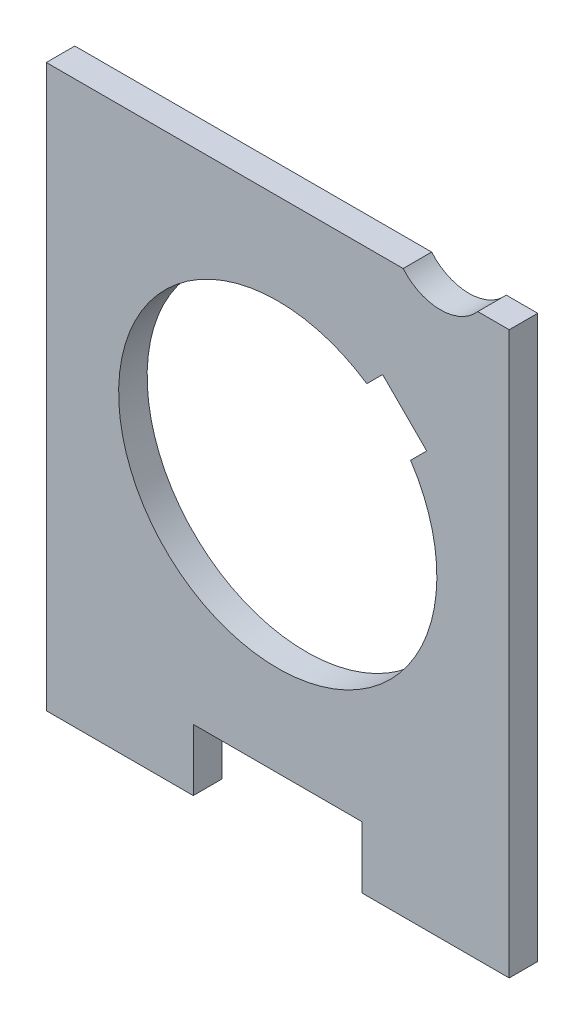
ISO-10303-21;
HEADER;
FILE_DESCRIPTION(('STEP AP214'),'2;1');
FILE_NAME('part.step','',(''),(''),'','','');
FILE_SCHEMA(('AUTOMOTIVE_DESIGN { 1 0 10303 214 1 1 1 1 }'));
ENDSEC;
DATA;
#1=APPLICATION_CONTEXT('core data for automotive mechanical design processes');
#2=APPLICATION_PROTOCOL_DEFINITION('international standard','automotive_design',2000,#1);
#3=PRODUCT_CONTEXT('',#1,'mechanical');
#4=PRODUCT('Part','Part','',(#3));
#5=PRODUCT_RELATED_PRODUCT_CATEGORY('part','',(#4));
#6=PRODUCT_DEFINITION_FORMATION('','',#4);
#7=PRODUCT_DEFINITION_CONTEXT('part definition',#1,'design');
#8=PRODUCT_DEFINITION('design','',#6,#7);
#9=PRODUCT_DEFINITION_SHAPE('','',#8);
#10=(LENGTH_UNIT() NAMED_UNIT(*) SI_UNIT(.MILLI.,.METRE.));
#11=(NAMED_UNIT(*) PLANE_ANGLE_UNIT() SI_UNIT($,.RADIAN.));
#12=(NAMED_UNIT(*) SI_UNIT($,.STERADIAN.) SOLID_ANGLE_UNIT());
#13=UNCERTAINTY_MEASURE_WITH_UNIT(LENGTH_MEASURE(1.E-05),#10,'distance_accuracy_value','');
#14=(GEOMETRIC_REPRESENTATION_CONTEXT(3) GLOBAL_UNCERTAINTY_ASSIGNED_CONTEXT((#13)) GLOBAL_UNIT_ASSIGNED_CONTEXT((#10,
#11,#12)) REPRESENTATION_CONTEXT('',''));
#15=CARTESIAN_POINT('',(0.,0.,0.));
#16=DIRECTION('',(0.,0.,1.));
#17=DIRECTION('',(1.,0.,0.));
#18=AXIS2_PLACEMENT_3D('',#15,#16,#17);
#19=CARTESIAN_POINT('',(0.,43.18,2.4638));
#20=DIRECTION('',(0.,-1.,0.));
#21=DIRECTION('',(0.,0.,-1.));
#22=AXIS2_PLACEMENT_3D('',#19,#20,#21);
#23=PLANE('',#22);
#24=DIRECTION('',(-1.,0.,0.));
#25=VECTOR('',#24,1.);
#26=CARTESIAN_POINT('',(0.,43.18,0.));
#27=LINE('',#26,#25);
#28=CARTESIAN_POINT('',(40.,43.18,0.));
#29=VERTEX_POINT('',#28);
#30=CARTESIAN_POINT('',(37.2830228705034,43.18,0.));
#31=VERTEX_POINT('',#30);
#32=EDGE_CURVE('E151',#29,#31,#27,.T.);
#33=ORIENTED_EDGE('',*,*,#32,.T.);
#34=DIRECTION('',(0.,0.,1.));
#35=VECTOR('',#34,1.);
#36=CARTESIAN_POINT('',(37.2830228705034,43.18,-5.00000000014378E-05));
#37=LINE('',#36,#35);
#38=CARTESIAN_POINT('',(37.2830228705034,43.18,2.4638));
#39=VERTEX_POINT('',#38);
#40=EDGE_CURVE('E46',#31,#39,#37,.T.);
#41=ORIENTED_EDGE('',*,*,#40,.T.);
#42=DIRECTION('',(-1.,0.,0.));
#43=VECTOR('',#42,1.);
#44=CARTESIAN_POINT('',(0.,43.18,2.4638));
#45=LINE('',#44,#43);
#46=CARTESIAN_POINT('',(40.,43.18,2.4638));
#47=VERTEX_POINT('',#46);
#48=EDGE_CURVE('E162',#47,#39,#45,.T.);
#49=ORIENTED_EDGE('',*,*,#48,.F.);
#50=DIRECTION('',(0.,0.,-1.));
#51=VECTOR('',#50,1.);
#52=CARTESIAN_POINT('',(40.,43.18,2.4638));
#53=LINE('',#52,#51);
#54=EDGE_CURVE('E161',#47,#29,#53,.T.);
#55=ORIENTED_EDGE('',*,*,#54,.T.);
#56=EDGE_LOOP('',(#33,#41,#49,#55));
#57=FACE_BOUND('',#56,.T.);
#58=ADVANCED_FACE('F32',(#57),#23,.F.);
#59=CARTESIAN_POINT('',(0.,0.,2.4638));
#60=DIRECTION('',(0.,1.,0.));
#61=DIRECTION('',(0.,0.,1.));
#62=AXIS2_PLACEMENT_3D('',#59,#60,#61);
#63=PLANE('',#62);
#64=DIRECTION('',(0.,0.,-1.));
#65=VECTOR('',#64,1.);
#66=CARTESIAN_POINT('',(27.3,0.,0.));
#67=LINE('',#66,#65);
#68=CARTESIAN_POINT('',(27.3,0.,2.4638));
#69=VERTEX_POINT('',#68);
#70=CARTESIAN_POINT('',(27.3,0.,0.));
#71=VERTEX_POINT('',#70);
#72=EDGE_CURVE('E216',#69,#71,#67,.T.);
#73=ORIENTED_EDGE('',*,*,#72,.F.);
#74=DIRECTION('',(1.,0.,0.));
#75=VECTOR('',#74,1.);
#76=CARTESIAN_POINT('',(0.,0.,2.4638));
#77=LINE('',#76,#75);
#78=CARTESIAN_POINT('',(12.7,0.,2.4638));
#79=VERTEX_POINT('',#78);
#80=EDGE_CURVE('E167',#79,#69,#77,.T.);
#81=ORIENTED_EDGE('',*,*,#80,.F.);
#82=DIRECTION('',(0.,0.,1.));
#83=VECTOR('',#82,1.);
#84=CARTESIAN_POINT('',(12.7,0.,0.));
#85=LINE('',#84,#83);
#86=CARTESIAN_POINT('',(12.7,0.,0.));
#87=VERTEX_POINT('',#86);
#88=EDGE_CURVE('E184',#87,#79,#85,.T.);
#89=ORIENTED_EDGE('',*,*,#88,.F.);
#90=DIRECTION('',(1.,0.,0.));
#91=VECTOR('',#90,1.);
#92=CARTESIAN_POINT('',(0.,0.,0.));
#93=LINE('',#92,#91);
#94=EDGE_CURVE('E155',#87,#71,#93,.T.);
#95=ORIENTED_EDGE('',*,*,#94,.T.);
#96=EDGE_LOOP('',(#73,#81,#89,#95));
#97=FACE_BOUND('',#96,.T.);
#98=ADVANCED_FACE('F306',(#97),#63,.F.);
#99=CARTESIAN_POINT('',(0.,0.,2.4638));
#100=DIRECTION('',(1.,0.,0.));
#101=DIRECTION('',(0.,0.,-1.));
#102=AXIS2_PLACEMENT_3D('',#99,#100,#101);
#103=PLANE('',#102);
#104=DIRECTION('',(0.,-1.,0.));
#105=VECTOR('',#104,1.);
#106=CARTESIAN_POINT('',(0.,0.,0.));
#107=LINE('',#106,#105);
#108=CARTESIAN_POINT('',(0.,43.18,0.));
#109=VERTEX_POINT('',#108);
#110=CARTESIAN_POINT('',(0.,-5.334,0.));
#111=VERTEX_POINT('',#110);
#112=EDGE_CURVE('E150',#109,#111,#107,.T.);
#113=ORIENTED_EDGE('',*,*,#112,.T.);
#114=DIRECTION('',(0.,0.,-1.));
#115=VECTOR('',#114,1.);
#116=CARTESIAN_POINT('',(0.,-5.334,0.));
#117=LINE('',#116,#115);
#118=CARTESIAN_POINT('',(0.,-5.334,2.4638));
#119=VERTEX_POINT('',#118);
#120=EDGE_CURVE('E187',#119,#111,#117,.T.);
#121=ORIENTED_EDGE('',*,*,#120,.F.);
#122=DIRECTION('',(0.,-1.,0.));
#123=VECTOR('',#122,1.);
#124=CARTESIAN_POINT('',(0.,0.,2.4638));
#125=LINE('',#124,#123);
#126=CARTESIAN_POINT('',(0.,43.18,2.4638));
#127=VERTEX_POINT('',#126);
#128=EDGE_CURVE('E154',#127,#119,#125,.T.);
#129=ORIENTED_EDGE('',*,*,#128,.F.);
#130=DIRECTION('',(0.,0.,-1.));
#131=VECTOR('',#130,1.);
#132=CARTESIAN_POINT('',(0.,43.18,2.4638));
#133=LINE('',#132,#131);
#134=EDGE_CURVE('E159',#127,#109,#133,.T.);
#135=ORIENTED_EDGE('',*,*,#134,.T.);
#136=EDGE_LOOP('',(#113,#121,#129,#135));
#137=FACE_BOUND('',#136,.T.);
#138=ADVANCED_FACE('F34',(#137),#103,.F.);
#139=CARTESIAN_POINT('',(40.,0.,2.4638));
#140=DIRECTION('',(-1.,0.,0.));
#141=DIRECTION('',(0.,0.,1.));
#142=AXIS2_PLACEMENT_3D('',#139,#140,#141);
#143=PLANE('',#142);
#144=DIRECTION('',(0.,1.,0.));
#145=VECTOR('',#144,1.);
#146=CARTESIAN_POINT('',(40.,0.,0.));
#147=LINE('',#146,#145);
#148=CARTESIAN_POINT('',(40.,-5.334,0.));
#149=VERTEX_POINT('',#148);
#150=EDGE_CURVE('E152',#149,#29,#147,.T.);
#151=ORIENTED_EDGE('',*,*,#150,.T.);
#152=ORIENTED_EDGE('',*,*,#54,.F.);
#153=DIRECTION('',(0.,1.,0.));
#154=VECTOR('',#153,1.);
#155=CARTESIAN_POINT('',(40.,0.,2.4638));
#156=LINE('',#155,#154);
#157=CARTESIAN_POINT('',(40.,-5.334,2.4638));
#158=VERTEX_POINT('',#157);
#159=EDGE_CURVE('E176',#158,#47,#156,.T.);
#160=ORIENTED_EDGE('',*,*,#159,.F.);
#161=DIRECTION('',(0.,0.,1.));
#162=VECTOR('',#161,1.);
#163=CARTESIAN_POINT('',(40.,-5.334,0.));
#164=LINE('',#163,#162);
#165=EDGE_CURVE('E232',#149,#158,#164,.T.);
#166=ORIENTED_EDGE('',*,*,#165,.F.);
#167=EDGE_LOOP('',(#151,#152,#160,#166));
#168=FACE_BOUND('',#167,.T.);
#169=ADVANCED_FACE('F283',(#168),#143,.F.);
#170=CARTESIAN_POINT('',(30.8369771294967,43.18,2.4638));
#171=VERTEX_POINT('',#170);
#172=EDGE_CURVE('E144',#171,#127,#45,.T.);
#173=ORIENTED_EDGE('',*,*,#172,.F.);
#174=DIRECTION('',(0.,0.,1.));
#175=VECTOR('',#174,1.);
#176=CARTESIAN_POINT('',(30.8369771294967,43.18,-5.00000000014378E-05));
#177=LINE('',#176,#175);
#178=CARTESIAN_POINT('',(30.8369771294967,43.18,0.));
#179=VERTEX_POINT('',#178);
#180=EDGE_CURVE('E132',#171,#179,#177,.F.);
#181=ORIENTED_EDGE('',*,*,#180,.T.);
#182=EDGE_CURVE('E142',#179,#109,#27,.T.);
#183=ORIENTED_EDGE('',*,*,#182,.T.);
#184=ORIENTED_EDGE('',*,*,#134,.F.);
#185=EDGE_LOOP('',(#173,#181,#183,#184));
#186=FACE_BOUND('',#185,.T.);
#187=ADVANCED_FACE('F140',(#186),#23,.F.);
#188=CARTESIAN_POINT('',(0.,0.,2.4638));
#189=DIRECTION('',(0.,0.,-1.));
#190=DIRECTION('',(-1.,0.,0.));
#191=AXIS2_PLACEMENT_3D('',#188,#189,#190);
#192=PLANE('',#191);
#193=DIRECTION('',(0.707106781186552,0.707106781186543,0.));
#194=VECTOR('',#193,1.);
#195=CARTESIAN_POINT('',(31.4819925855963,29.154809730873,2.4638));
#196=LINE('',#195,#194);
#197=CARTESIAN_POINT('',(31.4819925855963,29.154809730873,2.4638));
#198=VERTEX_POINT('',#197);
#199=CARTESIAN_POINT('',(32.8715265844376,30.5443437297142,2.4638));
#200=VERTEX_POINT('',#199);
#201=EDGE_CURVE('E290',#198,#200,#196,.T.);
#202=ORIENTED_EDGE('',*,*,#201,.F.);
#203=CARTESIAN_POINT('',(20.,21.59,2.4638));
#204=DIRECTION('',(0.,0.,1.));
#205=DIRECTION('',(1.,0.,0.));
#206=AXIS2_PLACEMENT_3D('',#203,#204,#205);
#207=CIRCLE('',#206,13.75);
#208=CARTESIAN_POINT('',(27.6932292072311,32.9863469745795,2.4638));
#209=VERTEX_POINT('',#208);
#210=EDGE_CURVE('E54',#209,#198,#207,.T.);
#211=ORIENTED_EDGE('',*,*,#210,.F.);
#212=DIRECTION('',(-0.70710678118655,-0.707106781186545,0.));
#213=VECTOR('',#212,1.);
#214=CARTESIAN_POINT('',(29.0613762734017,34.3544940407501,2.4638));
#215=LINE('',#214,#213);
#216=CARTESIAN_POINT('',(29.0613762734017,34.3544940407501,2.4638));
#217=VERTEX_POINT('',#216);
#218=EDGE_CURVE('E215',#217,#209,#215,.T.);
#219=ORIENTED_EDGE('',*,*,#218,.F.);
#220=DIRECTION('',(-0.707106781186543,0.707106781186552,0.));
#221=VECTOR('',#220,1.);
#222=CARTESIAN_POINT('',(32.8715265844376,30.5443437297142,2.4638));
#223=LINE('',#222,#221);
#224=EDGE_CURVE('E226',#200,#217,#223,.T.);
#225=ORIENTED_EDGE('',*,*,#224,.F.);
#226=EDGE_LOOP('',(#202,#211,#219,#225));
#227=FACE_BOUND('',#226,.T.);
#228=ORIENTED_EDGE('',*,*,#48,.T.);
#229=CARTESIAN_POINT('',(34.0600000000001,45.9426343544184,2.4638));
#230=DIRECTION('',(0.,0.,-1.));
#231=DIRECTION('',(-1.,0.,0.));
#232=AXIS2_PLACEMENT_3D('',#229,#230,#231);
#233=CIRCLE('',#232,4.245);
#234=EDGE_CURVE('E285',#39,#171,#233,.T.);
#235=ORIENTED_EDGE('',*,*,#234,.T.);
#236=ORIENTED_EDGE('',*,*,#172,.T.);
#237=ORIENTED_EDGE('',*,*,#128,.T.);
#238=DIRECTION('',(-1.,0.,0.));
#239=VECTOR('',#238,1.);
#240=CARTESIAN_POINT('',(0.,-5.334,2.4638));
#241=LINE('',#240,#239);
#242=CARTESIAN_POINT('',(12.7,-5.334,2.4638));
#243=VERTEX_POINT('',#242);
#244=EDGE_CURVE('E182',#243,#119,#241,.T.);
#245=ORIENTED_EDGE('',*,*,#244,.F.);
#246=DIRECTION('',(0.,1.,0.));
#247=VECTOR('',#246,1.);
#248=CARTESIAN_POINT('',(12.7,-5.334,2.4638));
#249=LINE('',#248,#247);
#250=EDGE_CURVE('E189',#243,#79,#249,.T.);
#251=ORIENTED_EDGE('',*,*,#250,.T.);
#252=ORIENTED_EDGE('',*,*,#80,.T.);
#253=DIRECTION('',(0.,1.,0.));
#254=VECTOR('',#253,1.);
#255=CARTESIAN_POINT('',(27.3,-5.334,2.4638));
#256=LINE('',#255,#254);
#257=CARTESIAN_POINT('',(27.3,-5.334,2.4638));
#258=VERTEX_POINT('',#257);
#259=EDGE_CURVE('E188',#258,#69,#256,.T.);
#260=ORIENTED_EDGE('',*,*,#259,.F.);
#261=DIRECTION('',(-1.,0.,0.));
#262=VECTOR('',#261,1.);
#263=CARTESIAN_POINT('',(40.,-5.334,2.4638));
#264=LINE('',#263,#262);
#265=EDGE_CURVE('E235',#158,#258,#264,.T.);
#266=ORIENTED_EDGE('',*,*,#265,.F.);
#267=ORIENTED_EDGE('',*,*,#159,.T.);
#268=EDGE_LOOP('',(#228,#235,#236,#237,#245,#251,#252,#260,#266,#267));
#269=FACE_BOUND('',#268,.T.);
#270=ADVANCED_FACE('F268',(#227,#269),#192,.F.);
#271=CARTESIAN_POINT('',(0.,0.,0.));
#272=DIRECTION('',(0.,0.,-1.));
#273=DIRECTION('',(-1.,0.,0.));
#274=AXIS2_PLACEMENT_3D('',#271,#272,#273);
#275=PLANE('',#274);
#276=CARTESIAN_POINT('',(34.0600000000001,45.9426343544184,0.));
#277=DIRECTION('',(0.,0.,-1.));
#278=DIRECTION('',(-1.,0.,0.));
#279=AXIS2_PLACEMENT_3D('',#276,#277,#278);
#280=CIRCLE('',#279,4.245);
#281=EDGE_CURVE('E11',#31,#179,#280,.T.);
#282=ORIENTED_EDGE('',*,*,#281,.F.);
#283=ORIENTED_EDGE('',*,*,#32,.F.);
#284=ORIENTED_EDGE('',*,*,#150,.F.);
#285=DIRECTION('',(1.,0.,0.));
#286=VECTOR('',#285,1.);
#287=CARTESIAN_POINT('',(40.,-5.334,0.));
#288=LINE('',#287,#286);
#289=CARTESIAN_POINT('',(27.3,-5.334,0.));
#290=VERTEX_POINT('',#289);
#291=EDGE_CURVE('E239',#290,#149,#288,.T.);
#292=ORIENTED_EDGE('',*,*,#291,.F.);
#293=DIRECTION('',(0.,1.,0.));
#294=VECTOR('',#293,1.);
#295=CARTESIAN_POINT('',(27.3,-5.334,0.));
#296=LINE('',#295,#294);
#297=EDGE_CURVE('E242',#290,#71,#296,.T.);
#298=ORIENTED_EDGE('',*,*,#297,.T.);
#299=ORIENTED_EDGE('',*,*,#94,.F.);
#300=DIRECTION('',(0.,1.,0.));
#301=VECTOR('',#300,1.);
#302=CARTESIAN_POINT('',(12.7,-5.334,0.));
#303=LINE('',#302,#301);
#304=CARTESIAN_POINT('',(12.7,-5.334,0.));
#305=VERTEX_POINT('',#304);
#306=EDGE_CURVE('E173',#305,#87,#303,.T.);
#307=ORIENTED_EDGE('',*,*,#306,.F.);
#308=DIRECTION('',(1.,0.,0.));
#309=VECTOR('',#308,1.);
#310=CARTESIAN_POINT('',(0.,-5.334,0.));
#311=LINE('',#310,#309);
#312=EDGE_CURVE('E251',#111,#305,#311,.T.);
#313=ORIENTED_EDGE('',*,*,#312,.F.);
#314=ORIENTED_EDGE('',*,*,#112,.F.);
#315=ORIENTED_EDGE('',*,*,#182,.F.);
#316=EDGE_LOOP('',(#282,#283,#284,#292,#298,#299,#307,#313,#314,#315));
#317=FACE_BOUND('',#316,.T.);
#318=CARTESIAN_POINT('',(20.,21.59,0.));
#319=DIRECTION('',(0.,0.,-1.));
#320=DIRECTION('',(-1.,0.,0.));
#321=AXIS2_PLACEMENT_3D('',#318,#319,#320);
#322=CIRCLE('',#321,13.75);
#323=CARTESIAN_POINT('',(31.4819925855963,29.154809730873,0.));
#324=VERTEX_POINT('',#323);
#325=CARTESIAN_POINT('',(27.6932292072311,32.9863469745795,0.));
#326=VERTEX_POINT('',#325);
#327=EDGE_CURVE('E40',#324,#326,#322,.T.);
#328=ORIENTED_EDGE('',*,*,#327,.F.);
#329=DIRECTION('',(-0.707106781186552,-0.707106781186543,0.));
#330=VECTOR('',#329,1.);
#331=CARTESIAN_POINT('',(1.16359142736147,-1.16359142736148,0.));
#332=LINE('',#331,#330);
#333=CARTESIAN_POINT('',(32.8715265844376,30.5443437297142,0.));
#334=VERTEX_POINT('',#333);
#335=EDGE_CURVE('E165',#334,#324,#332,.T.);
#336=ORIENTED_EDGE('',*,*,#335,.F.);
#337=DIRECTION('',(0.707106781186543,-0.707106781186552,0.));
#338=VECTOR('',#337,1.);
#339=CARTESIAN_POINT('',(31.7079351570761,31.7079351570757,0.));
#340=LINE('',#339,#338);
#341=CARTESIAN_POINT('',(29.0613762734017,34.3544940407501,0.));
#342=VERTEX_POINT('',#341);
#343=EDGE_CURVE('E199',#342,#334,#340,.T.);
#344=ORIENTED_EDGE('',*,*,#343,.F.);
#345=DIRECTION('',(0.70710678118655,0.707106781186545,0.));
#346=VECTOR('',#345,1.);
#347=CARTESIAN_POINT('',(-2.64655888367429,2.64655888367431,0.));
#348=LINE('',#347,#346);
#349=EDGE_CURVE('E202',#326,#342,#348,.T.);
#350=ORIENTED_EDGE('',*,*,#349,.F.);
#351=EDGE_LOOP('',(#328,#336,#344,#350));
#352=FACE_BOUND('',#351,.T.);
#353=ADVANCED_FACE('F147',(#317,#352),#275,.T.);
#354=CARTESIAN_POINT('',(12.7,-5.334,0.));
#355=DIRECTION('',(-1.,0.,0.));
#356=DIRECTION('',(0.,0.,1.));
#357=AXIS2_PLACEMENT_3D('',#354,#355,#356);
#358=PLANE('',#357);
#359=ORIENTED_EDGE('',*,*,#88,.T.);
#360=ORIENTED_EDGE('',*,*,#250,.F.);
#361=DIRECTION('',(0.,0.,1.));
#362=VECTOR('',#361,1.);
#363=CARTESIAN_POINT('',(12.7,-5.334,0.));
#364=LINE('',#363,#362);
#365=EDGE_CURVE('E252',#305,#243,#364,.T.);
#366=ORIENTED_EDGE('',*,*,#365,.F.);
#367=ORIENTED_EDGE('',*,*,#306,.T.);
#368=EDGE_LOOP('',(#359,#360,#366,#367));
#369=FACE_BOUND('',#368,.T.);
#370=ADVANCED_FACE('F266',(#369),#358,.F.);
#371=CARTESIAN_POINT('',(0.,-5.334,0.));
#372=DIRECTION('',(0.,1.,0.));
#373=DIRECTION('',(0.,0.,1.));
#374=AXIS2_PLACEMENT_3D('',#371,#372,#373);
#375=PLANE('',#374);
#376=ORIENTED_EDGE('',*,*,#120,.T.);
#377=ORIENTED_EDGE('',*,*,#312,.T.);
#378=ORIENTED_EDGE('',*,*,#365,.T.);
#379=ORIENTED_EDGE('',*,*,#244,.T.);
#380=EDGE_LOOP('',(#376,#377,#378,#379));
#381=FACE_BOUND('',#380,.T.);
#382=ADVANCED_FACE('F259',(#381),#375,.F.);
#383=CARTESIAN_POINT('',(27.3,-5.334,0.));
#384=DIRECTION('',(1.,0.,0.));
#385=DIRECTION('',(0.,0.,-1.));
#386=AXIS2_PLACEMENT_3D('',#383,#384,#385);
#387=PLANE('',#386);
#388=ORIENTED_EDGE('',*,*,#72,.T.);
#389=ORIENTED_EDGE('',*,*,#297,.F.);
#390=DIRECTION('',(0.,0.,-1.));
#391=VECTOR('',#390,1.);
#392=CARTESIAN_POINT('',(27.3,-5.334,0.));
#393=LINE('',#392,#391);
#394=EDGE_CURVE('E237',#258,#290,#393,.T.);
#395=ORIENTED_EDGE('',*,*,#394,.F.);
#396=ORIENTED_EDGE('',*,*,#259,.T.);
#397=EDGE_LOOP('',(#388,#389,#395,#396));
#398=FACE_BOUND('',#397,.T.);
#399=ADVANCED_FACE('F274',(#398),#387,.F.);
#400=CARTESIAN_POINT('',(0.,-5.334,0.));
#401=DIRECTION('',(0.,-1.,0.));
#402=DIRECTION('',(0.,0.,-1.));
#403=AXIS2_PLACEMENT_3D('',#400,#401,#402);
#404=PLANE('',#403);
#405=ORIENTED_EDGE('',*,*,#165,.T.);
#406=ORIENTED_EDGE('',*,*,#265,.T.);
#407=ORIENTED_EDGE('',*,*,#394,.T.);
#408=ORIENTED_EDGE('',*,*,#291,.T.);
#409=EDGE_LOOP('',(#405,#406,#407,#408));
#410=FACE_BOUND('',#409,.T.);
#411=ADVANCED_FACE('F278',(#410),#404,.T.);
#412=CARTESIAN_POINT('',(20.,21.59,-5.00000000001367E-05));
#413=DIRECTION('',(0.,0.,1.));
#414=DIRECTION('',(1.,0.,0.));
#415=AXIS2_PLACEMENT_3D('',#412,#413,#414);
#416=CYLINDRICAL_SURFACE('',#415,13.75);
#417=ORIENTED_EDGE('',*,*,#327,.T.);
#418=DIRECTION('',(0.,0.,1.));
#419=VECTOR('',#418,1.);
#420=CARTESIAN_POINT('',(27.6932292072311,32.9863469745795,-5.00000000001367E-05));
#421=LINE('',#420,#419);
#422=EDGE_CURVE('E206',#326,#209,#421,.T.);
#423=ORIENTED_EDGE('',*,*,#422,.T.);
#424=ORIENTED_EDGE('',*,*,#210,.T.);
#425=DIRECTION('',(0.,0.,1.));
#426=VECTOR('',#425,1.);
#427=CARTESIAN_POINT('',(31.4819925855963,29.154809730873,-5.00000000001367E-05));
#428=LINE('',#427,#426);
#429=EDGE_CURVE('E208',#324,#198,#428,.T.);
#430=ORIENTED_EDGE('',*,*,#429,.F.);
#431=EDGE_LOOP('',(#417,#423,#424,#430));
#432=FACE_BOUND('',#431,.T.);
#433=ADVANCED_FACE('F205',(#432),#416,.F.);
#434=CARTESIAN_POINT('',(29.0613762734017,34.3544940407501,-5.00000000001367E-05));
#435=DIRECTION('',(-0.707106781186545,0.70710678118655,0.));
#436=DIRECTION('',(-0.70710678118655,-0.707106781186545,0.));
#437=AXIS2_PLACEMENT_3D('',#434,#435,#436);
#438=PLANE('',#437);
#439=ORIENTED_EDGE('',*,*,#349,.T.);
#440=DIRECTION('',(0.,0.,1.));
#441=VECTOR('',#440,1.);
#442=CARTESIAN_POINT('',(29.0613762734017,34.3544940407501,-5.00000000001367E-05));
#443=LINE('',#442,#441);
#444=EDGE_CURVE('E217',#342,#217,#443,.T.);
#445=ORIENTED_EDGE('',*,*,#444,.T.);
#446=ORIENTED_EDGE('',*,*,#218,.T.);
#447=ORIENTED_EDGE('',*,*,#422,.F.);
#448=EDGE_LOOP('',(#439,#445,#446,#447));
#449=FACE_BOUND('',#448,.T.);
#450=ADVANCED_FACE('F212',(#449),#438,.F.);
#451=CARTESIAN_POINT('',(32.8715265844376,30.5443437297142,-5.00000000001367E-05));
#452=DIRECTION('',(0.707106781186552,0.707106781186543,0.));
#453=DIRECTION('',(-0.707106781186543,0.707106781186552,0.));
#454=AXIS2_PLACEMENT_3D('',#451,#452,#453);
#455=PLANE('',#454);
#456=ORIENTED_EDGE('',*,*,#343,.T.);
#457=DIRECTION('',(0.,0.,1.));
#458=VECTOR('',#457,1.);
#459=CARTESIAN_POINT('',(32.8715265844376,30.5443437297142,-5.00000000001367E-05));
#460=LINE('',#459,#458);
#461=EDGE_CURVE('E223',#334,#200,#460,.T.);
#462=ORIENTED_EDGE('',*,*,#461,.T.);
#463=ORIENTED_EDGE('',*,*,#224,.T.);
#464=ORIENTED_EDGE('',*,*,#444,.F.);
#465=EDGE_LOOP('',(#456,#462,#463,#464));
#466=FACE_BOUND('',#465,.T.);
#467=ADVANCED_FACE('F221',(#466),#455,.F.);
#468=CARTESIAN_POINT('',(31.4819925855963,29.154809730873,-5.00000000001367E-05));
#469=DIRECTION('',(0.707106781186543,-0.707106781186552,0.));
#470=DIRECTION('',(0.707106781186552,0.707106781186543,0.));
#471=AXIS2_PLACEMENT_3D('',#468,#469,#470);
#472=PLANE('',#471);
#473=ORIENTED_EDGE('',*,*,#335,.T.);
#474=ORIENTED_EDGE('',*,*,#429,.T.);
#475=ORIENTED_EDGE('',*,*,#201,.T.);
#476=ORIENTED_EDGE('',*,*,#461,.F.);
#477=EDGE_LOOP('',(#473,#474,#475,#476));
#478=FACE_BOUND('',#477,.T.);
#479=ADVANCED_FACE('F294',(#478),#472,.F.);
#480=CARTESIAN_POINT('',(34.0600000000001,45.9426343544184,-5.00000000014378E-05));
#481=DIRECTION('',(0.,0.,1.));
#482=DIRECTION('',(1.,0.,0.));
#483=AXIS2_PLACEMENT_3D('',#480,#481,#482);
#484=CYLINDRICAL_SURFACE('',#483,4.245);
#485=ORIENTED_EDGE('',*,*,#40,.F.);
#486=ORIENTED_EDGE('',*,*,#281,.T.);
#487=ORIENTED_EDGE('',*,*,#180,.F.);
#488=ORIENTED_EDGE('',*,*,#234,.F.);
#489=EDGE_LOOP('',(#485,#486,#487,#488));
#490=FACE_BOUND('',#489,.T.);
#491=ADVANCED_FACE('F131',(#490),#484,.F.);
#492=CLOSED_SHELL('',(#58,#98,#138,#169,#187,#270,#353,#370,#382,#399,#411,#433,#450,#467,#479,#491));
#493=MANIFOLD_SOLID_BREP('B2',#492);
#494=ADVANCED_BREP_SHAPE_REPRESENTATION('',(#18,#493),#14);
#495=SHAPE_DEFINITION_REPRESENTATION(#9,#494);
ENDSEC;
END-ISO-10303-21;
